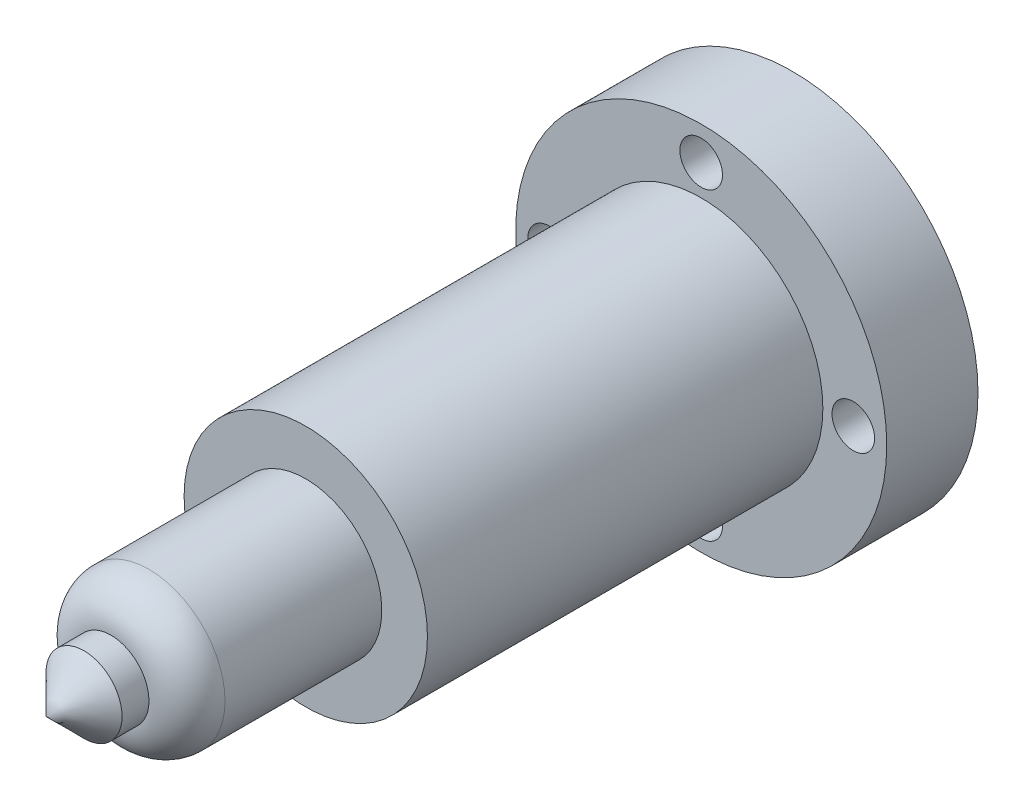
ISO-10303-21;
HEADER;
FILE_DESCRIPTION(('STEP AP214'),'2;1');
FILE_NAME('part.step','',(''),(''),'','','');
FILE_SCHEMA(('AUTOMOTIVE_DESIGN { 1 0 10303 214 1 1 1 1 }'));
ENDSEC;
DATA;
#1=APPLICATION_CONTEXT('core data for automotive mechanical design processes');
#2=APPLICATION_PROTOCOL_DEFINITION('international standard','automotive_design',2000,#1);
#3=PRODUCT_CONTEXT('',#1,'mechanical');
#4=PRODUCT('Part','Part','',(#3));
#5=PRODUCT_RELATED_PRODUCT_CATEGORY('part','',(#4));
#6=PRODUCT_DEFINITION_FORMATION('','',#4);
#7=PRODUCT_DEFINITION_CONTEXT('part definition',#1,'design');
#8=PRODUCT_DEFINITION('design','',#6,#7);
#9=PRODUCT_DEFINITION_SHAPE('','',#8);
#10=(LENGTH_UNIT() NAMED_UNIT(*) SI_UNIT(.MILLI.,.METRE.));
#11=(NAMED_UNIT(*) PLANE_ANGLE_UNIT() SI_UNIT($,.RADIAN.));
#12=(NAMED_UNIT(*) SI_UNIT($,.STERADIAN.) SOLID_ANGLE_UNIT());
#13=UNCERTAINTY_MEASURE_WITH_UNIT(LENGTH_MEASURE(1.E-05),#10,'distance_accuracy_value','');
#14=(GEOMETRIC_REPRESENTATION_CONTEXT(3) GLOBAL_UNCERTAINTY_ASSIGNED_CONTEXT((#13)) GLOBAL_UNIT_ASSIGNED_CONTEXT((#10,
#11,#12)) REPRESENTATION_CONTEXT('',''));
#15=CARTESIAN_POINT('',(0.,0.,0.));
#16=DIRECTION('',(0.,0.,1.));
#17=DIRECTION('',(1.,0.,0.));
#18=AXIS2_PLACEMENT_3D('',#15,#16,#17);
#19=CARTESIAN_POINT('',(0.,0.,122.7));
#20=DIRECTION('',(0.,0.,-1.));
#21=DIRECTION('',(-1.,0.,0.));
#22=AXIS2_PLACEMENT_3D('',#19,#20,#21);
#23=CYLINDRICAL_SURFACE('',#22,12.5);
#24=CARTESIAN_POINT('',(0.,0.,105.775));
#25=DIRECTION('',(0.,0.,1.));
#26=DIRECTION('',(1.,0.,0.));
#27=AXIS2_PLACEMENT_3D('',#24,#25,#26);
#28=CIRCLE('',#27,12.5);
#29=CARTESIAN_POINT('',(-12.5,0.,105.775));
#30=VERTEX_POINT('',#29);
#31=EDGE_CURVE('E56',#30,#30,#28,.F.);
#32=CARTESIAN_POINT('',(0.,0.,80.));
#33=DIRECTION('',(0.,0.,1.));
#34=DIRECTION('',(1.,0.,0.));
#35=AXIS2_PLACEMENT_3D('',#32,#33,#34);
#36=CIRCLE('',#35,12.5);
#37=CARTESIAN_POINT('',(-12.5,0.,80.));
#38=VERTEX_POINT('',#37);
#39=EDGE_CURVE('E141',#38,#38,#36,.T.);
#40=CARTESIAN_POINT('',(-12.5,0.,105.775));
#41=CARTESIAN_POINT('',(-12.5,0.,105.506510416667));
#42=CARTESIAN_POINT('',(-12.5,0.,105.238020833333));
#43=CARTESIAN_POINT('',(-12.5,0.,104.701041666667));
#44=CARTESIAN_POINT('',(-12.5,0.,104.432552083333));
#45=CARTESIAN_POINT('',(-12.5,0.,103.895572916667));
#46=CARTESIAN_POINT('',(-12.5,0.,103.627083333333));
#47=CARTESIAN_POINT('',(-12.5,0.,103.090104166667));
#48=CARTESIAN_POINT('',(-12.5,0.,102.821614583333));
#49=CARTESIAN_POINT('',(-12.5,0.,102.284635416667));
#50=CARTESIAN_POINT('',(-12.5,0.,102.016145833333));
#51=CARTESIAN_POINT('',(-12.5,0.,101.479166666667));
#52=CARTESIAN_POINT('',(-12.5,0.,101.210677083333));
#53=CARTESIAN_POINT('',(-12.5,0.,100.673697916667));
#54=CARTESIAN_POINT('',(-12.5,0.,100.405208333333));
#55=CARTESIAN_POINT('',(-12.5,0.,99.8682291666666));
#56=CARTESIAN_POINT('',(-12.5,0.,99.5997395833333));
#57=CARTESIAN_POINT('',(-12.5,0.,99.0627604166666));
#58=CARTESIAN_POINT('',(-12.5,0.,98.7942708333333));
#59=CARTESIAN_POINT('',(-12.5,0.,98.2572916666666));
#60=CARTESIAN_POINT('',(-12.5,0.,97.9888020833333));
#61=CARTESIAN_POINT('',(-12.5,0.,97.4518229166666));
#62=CARTESIAN_POINT('',(-12.5,0.,97.1833333333333));
#63=CARTESIAN_POINT('',(-12.5,0.,96.6463541666666));
#64=CARTESIAN_POINT('',(-12.5,0.,96.3778645833333));
#65=CARTESIAN_POINT('',(-12.5,0.,95.8408854166667));
#66=CARTESIAN_POINT('',(-12.5,0.,95.5723958333333));
#67=CARTESIAN_POINT('',(-12.5,0.,95.0354166666666));
#68=CARTESIAN_POINT('',(-12.5,0.,94.7669270833333));
#69=CARTESIAN_POINT('',(-12.5,0.,94.2299479166666));
#70=CARTESIAN_POINT('',(-12.5,0.,93.9614583333333));
#71=CARTESIAN_POINT('',(-12.5,0.,93.4244791666666));
#72=CARTESIAN_POINT('',(-12.5,0.,93.1559895833333));
#73=CARTESIAN_POINT('',(-12.5,0.,92.6190104166666));
#74=CARTESIAN_POINT('',(-12.5,0.,92.3505208333333));
#75=CARTESIAN_POINT('',(-12.5,0.,91.8135416666667));
#76=CARTESIAN_POINT('',(-12.5,0.,91.5450520833333));
#77=CARTESIAN_POINT('',(-12.5,0.,91.0080729166666));
#78=CARTESIAN_POINT('',(-12.5,0.,90.7395833333333));
#79=CARTESIAN_POINT('',(-12.5,0.,90.2026041666666));
#80=CARTESIAN_POINT('',(-12.5,0.,89.9341145833333));
#81=CARTESIAN_POINT('',(-12.5,0.,89.3971354166666));
#82=CARTESIAN_POINT('',(-12.5,0.,89.1286458333333));
#83=CARTESIAN_POINT('',(-12.5,0.,88.5916666666667));
#84=CARTESIAN_POINT('',(-12.5,0.,88.3231770833333));
#85=CARTESIAN_POINT('',(-12.5,0.,87.7861979166667));
#86=CARTESIAN_POINT('',(-12.5,0.,87.5177083333333));
#87=CARTESIAN_POINT('',(-12.5,0.,86.9807291666667));
#88=CARTESIAN_POINT('',(-12.5,0.,86.7122395833333));
#89=CARTESIAN_POINT('',(-12.5,0.,86.1752604166666));
#90=CARTESIAN_POINT('',(-12.5,0.,85.9067708333333));
#91=CARTESIAN_POINT('',(-12.5,0.,85.3697916666667));
#92=CARTESIAN_POINT('',(-12.5,0.,85.1013020833333));
#93=CARTESIAN_POINT('',(-12.5,0.,84.5643229166667));
#94=CARTESIAN_POINT('',(-12.5,0.,84.2958333333333));
#95=CARTESIAN_POINT('',(-12.5,0.,83.7588541666667));
#96=CARTESIAN_POINT('',(-12.5,0.,83.4903645833333));
#97=CARTESIAN_POINT('',(-12.5,0.,82.9533854166667));
#98=CARTESIAN_POINT('',(-12.5,0.,82.6848958333333));
#99=CARTESIAN_POINT('',(-12.5,0.,82.1479166666667));
#100=CARTESIAN_POINT('',(-12.5,0.,81.8794270833333));
#101=CARTESIAN_POINT('',(-12.5,0.,81.3424479166667));
#102=CARTESIAN_POINT('',(-12.5,0.,81.0739583333333));
#103=CARTESIAN_POINT('',(-12.5,0.,80.5369791666667));
#104=CARTESIAN_POINT('',(-12.5,0.,80.2684895833333));
#105=CARTESIAN_POINT('',(-12.5,0.,80.));
#106=B_SPLINE_CURVE_WITH_KNOTS('',3,(#40,#41,#42,#43,#44,#45,#46,#47,#48,#49,#50,#51,#52,#53,
#54,#55,#56,#57,#58,#59,#60,#61,#62,#63,#64,#65,#66,#67,#68,#69,#70,#71,#72,#73,#74,#75,#76,#77,
#78,#79,#80,#81,#82,#83,#84,#85,#86,#87,#88,#89,#90,#91,#92,#93,#94,#95,#96,#97,#98,#99,#100,
#101,#102,#103,#104,#105),.UNSPECIFIED.,.F.,.F.,(4,2,2,2,2,2,2,2,2,2,2,2,2,2,2,2,2,2,2,2,2,2,2,
2,2,2,2,2,2,2,2,2,4),(0.,0.805468749999996,1.61093749999999,2.41640624999999,3.221875,
4.02734375,4.83281249999999,5.63828124999999,6.44374999999998,7.24921874999999,8.05468749999999,
8.86015624999999,9.66562499999998,10.47109375,11.2765625,12.08203125,12.8875,13.69296875,
14.4984375,15.30390625,16.109375,16.91484375,17.7203125,18.52578125,19.33125,20.13671875,
20.9421875,21.74765625,22.553125,23.35859375,24.1640625,24.96953125,25.775),.UNSPECIFIED.);
#107=EDGE_CURVE('BSEAM47',#30,#38,#106,.T.);
#108=ORIENTED_EDGE('',*,*,#31,.T.);
#109=ORIENTED_EDGE('',*,*,#39,.T.);
#110=ORIENTED_EDGE('',*,*,#107,.T.);
#111=ORIENTED_EDGE('',*,*,#107,.F.);
#112=EDGE_LOOP('',(#108,#110,#109,#111));
#113=FACE_BOUND('',#112,.T.);
#114=ADVANCED_FACE('F47',(#113),#23,.T.);
#115=CARTESIAN_POINT('',(0.,0.,15.));
#116=DIRECTION('',(0.,0.,-1.));
#117=DIRECTION('',(-1.,0.,0.));
#118=AXIS2_PLACEMENT_3D('',#115,#116,#117);
#119=CYLINDRICAL_SURFACE('',#118,30.5);
#120=CARTESIAN_POINT('',(0.,0.,15.));
#121=DIRECTION('',(0.,0.,1.));
#122=DIRECTION('',(1.,0.,0.));
#123=AXIS2_PLACEMENT_3D('',#120,#121,#122);
#124=CIRCLE('',#123,30.5);
#125=CARTESIAN_POINT('',(30.5,0.,15.));
#126=VERTEX_POINT('',#125);
#127=EDGE_CURVE('E136',#126,#126,#124,.T.);
#128=ORIENTED_EDGE('',*,*,#127,.F.);
#129=EDGE_LOOP('',(#128));
#130=FACE_BOUND('',#129,.T.);
#131=CARTESIAN_POINT('',(0.,0.,0.));
#132=DIRECTION('',(0.,0.,1.));
#133=DIRECTION('',(1.,0.,0.));
#134=AXIS2_PLACEMENT_3D('',#131,#132,#133);
#135=CIRCLE('',#134,30.5);
#136=CARTESIAN_POINT('',(30.5,0.,0.));
#137=VERTEX_POINT('',#136);
#138=EDGE_CURVE('E133',#137,#137,#135,.T.);
#139=ORIENTED_EDGE('',*,*,#138,.T.);
#140=EDGE_LOOP('',(#139));
#141=FACE_BOUND('',#140,.T.);
#142=ADVANCED_FACE('F70',(#130,#141),#119,.T.);
#143=CARTESIAN_POINT('',(0.,0.,15.));
#144=DIRECTION('',(0.,0.,1.));
#145=DIRECTION('',(1.,0.,0.));
#146=AXIS2_PLACEMENT_3D('',#143,#144,#145);
#147=PLANE('',#146);
#148=CARTESIAN_POINT('',(0.,0.,15.));
#149=DIRECTION('',(0.,0.,1.));
#150=DIRECTION('',(1.,0.,0.));
#151=AXIS2_PLACEMENT_3D('',#148,#149,#150);
#152=CIRCLE('',#151,20.);
#153=CARTESIAN_POINT('',(20.,0.,15.));
#154=VERTEX_POINT('',#153);
#155=EDGE_CURVE('E159',#154,#154,#152,.T.);
#156=ORIENTED_EDGE('',*,*,#155,.F.);
#157=EDGE_LOOP('',(#156));
#158=FACE_BOUND('',#157,.T.);
#159=CARTESIAN_POINT('',(0.,25.,15.));
#160=DIRECTION('',(0.,0.,1.));
#161=DIRECTION('',(1.,0.,0.));
#162=AXIS2_PLACEMENT_3D('',#159,#160,#161);
#163=CIRCLE('',#162,3.5);
#164=CARTESIAN_POINT('',(3.5,25.,15.));
#165=VERTEX_POINT('',#164);
#166=EDGE_CURVE('E143',#165,#165,#163,.T.);
#167=ORIENTED_EDGE('',*,*,#166,.F.);
#168=EDGE_LOOP('',(#167));
#169=FACE_BOUND('',#168,.T.);
#170=CARTESIAN_POINT('',(25.,0.,15.));
#171=DIRECTION('',(0.,0.,1.));
#172=DIRECTION('',(1.,0.,0.));
#173=AXIS2_PLACEMENT_3D('',#170,#171,#172);
#174=CIRCLE('',#173,3.5);
#175=CARTESIAN_POINT('',(28.5,0.,15.));
#176=VERTEX_POINT('',#175);
#177=EDGE_CURVE('E166',#176,#176,#174,.T.);
#178=ORIENTED_EDGE('',*,*,#177,.F.);
#179=EDGE_LOOP('',(#178));
#180=FACE_BOUND('',#179,.T.);
#181=CARTESIAN_POINT('',(-1.74574066942157E-13,-25.,15.));
#182=DIRECTION('',(0.,0.,1.));
#183=DIRECTION('',(1.,0.,0.));
#184=AXIS2_PLACEMENT_3D('',#181,#182,#183);
#185=CIRCLE('',#184,3.5);
#186=CARTESIAN_POINT('',(3.49999999999983,-25.,15.));
#187=VERTEX_POINT('',#186);
#188=EDGE_CURVE('E172',#187,#187,#185,.T.);
#189=ORIENTED_EDGE('',*,*,#188,.F.);
#190=EDGE_LOOP('',(#189));
#191=FACE_BOUND('',#190,.T.);
#192=CARTESIAN_POINT('',(-25.,2.61861100413235E-13,15.));
#193=DIRECTION('',(0.,0.,1.));
#194=DIRECTION('',(1.,0.,0.));
#195=AXIS2_PLACEMENT_3D('',#192,#193,#194);
#196=CIRCLE('',#195,3.5);
#197=CARTESIAN_POINT('',(-21.5,2.61861100413235E-13,15.));
#198=VERTEX_POINT('',#197);
#199=EDGE_CURVE('E178',#198,#198,#196,.T.);
#200=ORIENTED_EDGE('',*,*,#199,.F.);
#201=EDGE_LOOP('',(#200));
#202=FACE_BOUND('',#201,.T.);
#203=ORIENTED_EDGE('',*,*,#127,.T.);
#204=EDGE_LOOP('',(#203));
#205=FACE_BOUND('',#204,.T.);
#206=ADVANCED_FACE('F77',(#158,#169,#180,#191,#202,#205),#147,.T.);
#207=CARTESIAN_POINT('',(0.,0.,0.));
#208=DIRECTION('',(0.,0.,1.));
#209=DIRECTION('',(1.,0.,0.));
#210=AXIS2_PLACEMENT_3D('',#207,#208,#209);
#211=PLANE('',#210);
#212=CARTESIAN_POINT('',(0.,25.,0.));
#213=DIRECTION('',(0.,0.,1.));
#214=DIRECTION('',(1.,0.,0.));
#215=AXIS2_PLACEMENT_3D('',#212,#213,#214);
#216=CIRCLE('',#215,3.5);
#217=CARTESIAN_POINT('',(3.5,25.,0.));
#218=VERTEX_POINT('',#217);
#219=EDGE_CURVE('E118',#218,#218,#216,.T.);
#220=ORIENTED_EDGE('',*,*,#219,.T.);
#221=EDGE_LOOP('',(#220));
#222=FACE_BOUND('',#221,.T.);
#223=CARTESIAN_POINT('',(25.,0.,0.));
#224=DIRECTION('',(0.,0.,1.));
#225=DIRECTION('',(1.,0.,0.));
#226=AXIS2_PLACEMENT_3D('',#223,#224,#225);
#227=CIRCLE('',#226,3.5);
#228=CARTESIAN_POINT('',(28.5,0.,0.));
#229=VERTEX_POINT('',#228);
#230=EDGE_CURVE('E122',#229,#229,#227,.T.);
#231=ORIENTED_EDGE('',*,*,#230,.T.);
#232=EDGE_LOOP('',(#231));
#233=FACE_BOUND('',#232,.T.);
#234=CARTESIAN_POINT('',(-1.74574066942157E-13,-25.,0.));
#235=DIRECTION('',(0.,0.,1.));
#236=DIRECTION('',(1.,0.,0.));
#237=AXIS2_PLACEMENT_3D('',#234,#235,#236);
#238=CIRCLE('',#237,3.5);
#239=CARTESIAN_POINT('',(3.49999999999983,-25.,0.));
#240=VERTEX_POINT('',#239);
#241=EDGE_CURVE('E126',#240,#240,#238,.T.);
#242=ORIENTED_EDGE('',*,*,#241,.T.);
#243=EDGE_LOOP('',(#242));
#244=FACE_BOUND('',#243,.T.);
#245=CARTESIAN_POINT('',(-25.,2.61861100413235E-13,0.));
#246=DIRECTION('',(0.,0.,1.));
#247=DIRECTION('',(1.,0.,0.));
#248=AXIS2_PLACEMENT_3D('',#245,#246,#247);
#249=CIRCLE('',#248,3.5);
#250=CARTESIAN_POINT('',(-21.5,2.61861100413235E-13,0.));
#251=VERTEX_POINT('',#250);
#252=EDGE_CURVE('E130',#251,#251,#249,.T.);
#253=ORIENTED_EDGE('',*,*,#252,.T.);
#254=EDGE_LOOP('',(#253));
#255=FACE_BOUND('',#254,.T.);
#256=ORIENTED_EDGE('',*,*,#138,.F.);
#257=EDGE_LOOP('',(#256));
#258=FACE_BOUND('',#257,.T.);
#259=ADVANCED_FACE('F106',(#222,#233,#244,#255,#258),#211,.F.);
#260=CARTESIAN_POINT('',(-25.,2.61861100413235E-13,0.));
#261=DIRECTION('',(0.,0.,1.));
#262=DIRECTION('',(1.,0.,0.));
#263=AXIS2_PLACEMENT_3D('',#260,#261,#262);
#264=CYLINDRICAL_SURFACE('',#263,3.5);
#265=ORIENTED_EDGE('',*,*,#252,.F.);
#266=EDGE_LOOP('',(#265));
#267=FACE_BOUND('',#266,.T.);
#268=ORIENTED_EDGE('',*,*,#199,.T.);
#269=EDGE_LOOP('',(#268));
#270=FACE_BOUND('',#269,.T.);
#271=ADVANCED_FACE('F102',(#267,#270),#264,.F.);
#272=CARTESIAN_POINT('',(-1.74574066942157E-13,-25.,0.));
#273=DIRECTION('',(0.,0.,1.));
#274=DIRECTION('',(1.,0.,0.));
#275=AXIS2_PLACEMENT_3D('',#272,#273,#274);
#276=CYLINDRICAL_SURFACE('',#275,3.5);
#277=ORIENTED_EDGE('',*,*,#241,.F.);
#278=EDGE_LOOP('',(#277));
#279=FACE_BOUND('',#278,.T.);
#280=ORIENTED_EDGE('',*,*,#188,.T.);
#281=EDGE_LOOP('',(#280));
#282=FACE_BOUND('',#281,.T.);
#283=ADVANCED_FACE('F98',(#279,#282),#276,.F.);
#284=CARTESIAN_POINT('',(25.,0.,0.));
#285=DIRECTION('',(0.,0.,1.));
#286=DIRECTION('',(1.,0.,0.));
#287=AXIS2_PLACEMENT_3D('',#284,#285,#286);
#288=CYLINDRICAL_SURFACE('',#287,3.5);
#289=ORIENTED_EDGE('',*,*,#230,.F.);
#290=EDGE_LOOP('',(#289));
#291=FACE_BOUND('',#290,.T.);
#292=ORIENTED_EDGE('',*,*,#177,.T.);
#293=EDGE_LOOP('',(#292));
#294=FACE_BOUND('',#293,.T.);
#295=ADVANCED_FACE('F94',(#291,#294),#288,.F.);
#296=CARTESIAN_POINT('',(0.,25.,0.));
#297=DIRECTION('',(0.,0.,1.));
#298=DIRECTION('',(1.,0.,0.));
#299=AXIS2_PLACEMENT_3D('',#296,#297,#298);
#300=CYLINDRICAL_SURFACE('',#299,3.5);
#301=ORIENTED_EDGE('',*,*,#219,.F.);
#302=EDGE_LOOP('',(#301));
#303=FACE_BOUND('',#302,.T.);
#304=ORIENTED_EDGE('',*,*,#166,.T.);
#305=EDGE_LOOP('',(#304));
#306=FACE_BOUND('',#305,.T.);
#307=ADVANCED_FACE('F90',(#303,#306),#300,.F.);
#308=CARTESIAN_POINT('',(0.,0.,80.));
#309=DIRECTION('',(0.,0.,-1.));
#310=DIRECTION('',(-1.,0.,0.));
#311=AXIS2_PLACEMENT_3D('',#308,#309,#310);
#312=CYLINDRICAL_SURFACE('',#311,20.);
#313=CARTESIAN_POINT('',(0.,0.,80.));
#314=DIRECTION('',(0.,0.,1.));
#315=DIRECTION('',(1.,0.,0.));
#316=AXIS2_PLACEMENT_3D('',#313,#314,#315);
#317=CIRCLE('',#316,20.);
#318=CARTESIAN_POINT('',(20.,0.,80.));
#319=VERTEX_POINT('',#318);
#320=EDGE_CURVE('E155',#319,#319,#317,.T.);
#321=ORIENTED_EDGE('',*,*,#320,.F.);
#322=EDGE_LOOP('',(#321));
#323=FACE_BOUND('',#322,.T.);
#324=ORIENTED_EDGE('',*,*,#155,.T.);
#325=EDGE_LOOP('',(#324));
#326=FACE_BOUND('',#325,.T.);
#327=ADVANCED_FACE('F86',(#323,#326),#312,.T.);
#328=CARTESIAN_POINT('',(0.,0.,80.));
#329=DIRECTION('',(0.,0.,1.));
#330=DIRECTION('',(1.,0.,0.));
#331=AXIS2_PLACEMENT_3D('',#328,#329,#330);
#332=PLANE('',#331);
#333=ORIENTED_EDGE('',*,*,#39,.F.);
#334=EDGE_LOOP('',(#333));
#335=FACE_BOUND('',#334,.T.);
#336=ORIENTED_EDGE('',*,*,#320,.T.);
#337=EDGE_LOOP('',(#336));
#338=FACE_BOUND('',#337,.T.);
#339=ADVANCED_FACE('F84',(#335,#338),#332,.T.);
#340=CARTESIAN_POINT('',(0.,0.,112.025));
#341=DIRECTION('',(0.,0.,1.));
#342=DIRECTION('',(1.,0.,0.));
#343=AXIS2_PLACEMENT_3D('',#340,#341,#342);
#344=CYLINDRICAL_SURFACE('',#343,6.25);
#345=CARTESIAN_POINT('',(0.,0.,116.45));
#346=DIRECTION('',(0.,0.,1.));
#347=DIRECTION('',(1.,0.,0.));
#348=AXIS2_PLACEMENT_3D('',#345,#346,#347);
#349=CIRCLE('',#348,6.25);
#350=CARTESIAN_POINT('',(6.25,0.,116.45));
#351=VERTEX_POINT('',#350);
#352=EDGE_CURVE('E11',#351,#351,#349,.F.);
#353=CARTESIAN_POINT('',(0.,0.,112.025));
#354=DIRECTION('',(0.,0.,1.));
#355=DIRECTION('',(1.,0.,0.));
#356=AXIS2_PLACEMENT_3D('',#353,#354,#355);
#357=CIRCLE('',#356,6.25);
#358=CARTESIAN_POINT('',(6.25,0.,112.025));
#359=VERTEX_POINT('',#358);
#360=EDGE_CURVE('E154',#359,#359,#357,.T.);
#361=CARTESIAN_POINT('',(6.25,0.,116.45));
#362=CARTESIAN_POINT('',(6.25,0.,116.40390625));
#363=CARTESIAN_POINT('',(6.25,0.,116.3578125));
#364=CARTESIAN_POINT('',(6.25,0.,116.265625));
#365=CARTESIAN_POINT('',(6.25,0.,116.21953125));
#366=CARTESIAN_POINT('',(6.25,0.,116.12734375));
#367=CARTESIAN_POINT('',(6.25,0.,116.08125));
#368=CARTESIAN_POINT('',(6.25,0.,115.9890625));
#369=CARTESIAN_POINT('',(6.25,0.,115.94296875));
#370=CARTESIAN_POINT('',(6.25,0.,115.85078125));
#371=CARTESIAN_POINT('',(6.25,0.,115.8046875));
#372=CARTESIAN_POINT('',(6.25,0.,115.7125));
#373=CARTESIAN_POINT('',(6.25,0.,115.66640625));
#374=CARTESIAN_POINT('',(6.25,0.,115.57421875));
#375=CARTESIAN_POINT('',(6.25,0.,115.528125));
#376=CARTESIAN_POINT('',(6.25,0.,115.4359375));
#377=CARTESIAN_POINT('',(6.25,0.,115.38984375));
#378=CARTESIAN_POINT('',(6.25,0.,115.29765625));
#379=CARTESIAN_POINT('',(6.25,0.,115.2515625));
#380=CARTESIAN_POINT('',(6.25,0.,115.159375));
#381=CARTESIAN_POINT('',(6.25,0.,115.11328125));
#382=CARTESIAN_POINT('',(6.25,0.,115.02109375));
#383=CARTESIAN_POINT('',(6.25,0.,114.975));
#384=CARTESIAN_POINT('',(6.25,0.,114.8828125));
#385=CARTESIAN_POINT('',(6.25,0.,114.83671875));
#386=CARTESIAN_POINT('',(6.25,0.,114.74453125));
#387=CARTESIAN_POINT('',(6.25,0.,114.6984375));
#388=CARTESIAN_POINT('',(6.25,0.,114.60625));
#389=CARTESIAN_POINT('',(6.25,0.,114.56015625));
#390=CARTESIAN_POINT('',(6.25,0.,114.46796875));
#391=CARTESIAN_POINT('',(6.25,0.,114.421875));
#392=CARTESIAN_POINT('',(6.25,0.,114.3296875));
#393=CARTESIAN_POINT('',(6.25,0.,114.28359375));
#394=CARTESIAN_POINT('',(6.25,0.,114.19140625));
#395=CARTESIAN_POINT('',(6.25,0.,114.1453125));
#396=CARTESIAN_POINT('',(6.25,0.,114.053125));
#397=CARTESIAN_POINT('',(6.25,0.,114.00703125));
#398=CARTESIAN_POINT('',(6.25,0.,113.91484375));
#399=CARTESIAN_POINT('',(6.25,0.,113.86875));
#400=CARTESIAN_POINT('',(6.25,0.,113.7765625));
#401=CARTESIAN_POINT('',(6.25,0.,113.73046875));
#402=CARTESIAN_POINT('',(6.25,0.,113.63828125));
#403=CARTESIAN_POINT('',(6.25,0.,113.5921875));
#404=CARTESIAN_POINT('',(6.25,0.,113.5));
#405=CARTESIAN_POINT('',(6.25,0.,113.45390625));
#406=CARTESIAN_POINT('',(6.25,0.,113.36171875));
#407=CARTESIAN_POINT('',(6.25,0.,113.315625));
#408=CARTESIAN_POINT('',(6.25,0.,113.2234375));
#409=CARTESIAN_POINT('',(6.25,0.,113.17734375));
#410=CARTESIAN_POINT('',(6.25,0.,113.08515625));
#411=CARTESIAN_POINT('',(6.25,0.,113.0390625));
#412=CARTESIAN_POINT('',(6.25,0.,112.946875));
#413=CARTESIAN_POINT('',(6.25,0.,112.90078125));
#414=CARTESIAN_POINT('',(6.25,0.,112.80859375));
#415=CARTESIAN_POINT('',(6.25,0.,112.7625));
#416=CARTESIAN_POINT('',(6.25,0.,112.6703125));
#417=CARTESIAN_POINT('',(6.25,0.,112.62421875));
#418=CARTESIAN_POINT('',(6.25,0.,112.53203125));
#419=CARTESIAN_POINT('',(6.25,0.,112.4859375));
#420=CARTESIAN_POINT('',(6.25,0.,112.39375));
#421=CARTESIAN_POINT('',(6.25,0.,112.34765625));
#422=CARTESIAN_POINT('',(6.25,0.,112.25546875));
#423=CARTESIAN_POINT('',(6.25,0.,112.209375));
#424=CARTESIAN_POINT('',(6.25,0.,112.1171875));
#425=CARTESIAN_POINT('',(6.25,0.,112.07109375));
#426=CARTESIAN_POINT('',(6.25,0.,112.025));
#427=B_SPLINE_CURVE_WITH_KNOTS('',3,(#361,#362,#363,#364,#365,#366,#367,#368,#369,#370,#371,
#372,#373,#374,#375,#376,#377,#378,#379,#380,#381,#382,#383,#384,#385,#386,#387,#388,#389,#390,
#391,#392,#393,#394,#395,#396,#397,#398,#399,#400,#401,#402,#403,#404,#405,#406,#407,#408,#409,
#410,#411,#412,#413,#414,#415,#416,#417,#418,#419,#420,#421,#422,#423,#424,#425,#426),
.UNSPECIFIED.,.F.,.F.,(4,2,2,2,2,2,2,2,2,2,2,2,2,2,2,2,2,2,2,2,2,2,2,2,2,2,2,2,2,2,2,2,4),(0.,
0.138281250000011,0.276562500000008,0.414843750000005,0.553125000000002,0.691406250000012,
0.829687500000009,0.967968750000006,1.10625,1.24453125000001,1.38281250000001,1.52109375000001,
1.659375,1.79765625000002,1.93593750000001,2.07421875000001,2.21250000000001,2.35078125000002,
2.48906250000001,2.62734375000001,2.76562500000001,2.90390625000002,3.04218750000002,
3.18046875000001,3.31875000000001,3.45703125000002,3.59531250000002,3.73359375000001,
3.87187500000002,4.01015625000002,4.14843750000002,4.28671875000002,4.42500000000001),.UNSPECIFIED.);
#428=EDGE_CURVE('BSEAM66',#351,#359,#427,.T.);
#429=ORIENTED_EDGE('',*,*,#352,.T.);
#430=ORIENTED_EDGE('',*,*,#360,.T.);
#431=ORIENTED_EDGE('',*,*,#428,.T.);
#432=ORIENTED_EDGE('',*,*,#428,.F.);
#433=EDGE_LOOP('',(#429,#431,#430,#432));
#434=FACE_BOUND('',#433,.T.);
#435=ADVANCED_FACE('F66',(#434),#344,.T.);
#436=CARTESIAN_POINT('',(0.,0.,105.775));
#437=DIRECTION('',(0.,0.,1.));
#438=DIRECTION('',(1.,0.,0.));
#439=AXIS2_PLACEMENT_3D('',#436,#437,#438);
#440=DEGENERATE_TOROIDAL_SURFACE('',#439,6.25,6.25,.T.);
#441=ORIENTED_EDGE('',*,*,#31,.F.);
#442=EDGE_LOOP('',(#441));
#443=FACE_BOUND('',#442,.T.);
#444=ORIENTED_EDGE('',*,*,#360,.F.);
#445=EDGE_LOOP('',(#444));
#446=FACE_BOUND('',#445,.T.);
#447=ADVANCED_FACE('F60',(#443,#446),#440,.T.);
#448=CARTESIAN_POINT('',(0.,0.,116.45));
#449=DIRECTION('',(0.,0.,-1.));
#450=DIRECTION('',(-1.,0.,0.));
#451=AXIS2_PLACEMENT_3D('',#448,#449,#450);
#452=CONICAL_SURFACE('',#451,6.24999999999999,0.785398163397448);
#453=ORIENTED_EDGE('',*,*,#352,.F.);
#454=EDGE_LOOP('',(#453));
#455=FACE_BOUND('',#454,.T.);
#456=CARTESIAN_POINT('',(0.,0.,122.7));
#457=VERTEX_POINT('',#456);
#458=VERTEX_LOOP('',#457);
#459=FACE_BOUND('',#458,.T.);
#460=ADVANCED_FACE('F50',(#455,#459),#452,.T.);
#461=CLOSED_SHELL('',(#114,#142,#206,#259,#271,#283,#295,#307,#327,#339,#435,#447,#460));
#462=MANIFOLD_SOLID_BREP('B2',#461);
#463=ADVANCED_BREP_SHAPE_REPRESENTATION('',(#18,#462),#14);
#464=SHAPE_DEFINITION_REPRESENTATION(#9,#463);
ENDSEC;
END-ISO-10303-21;
